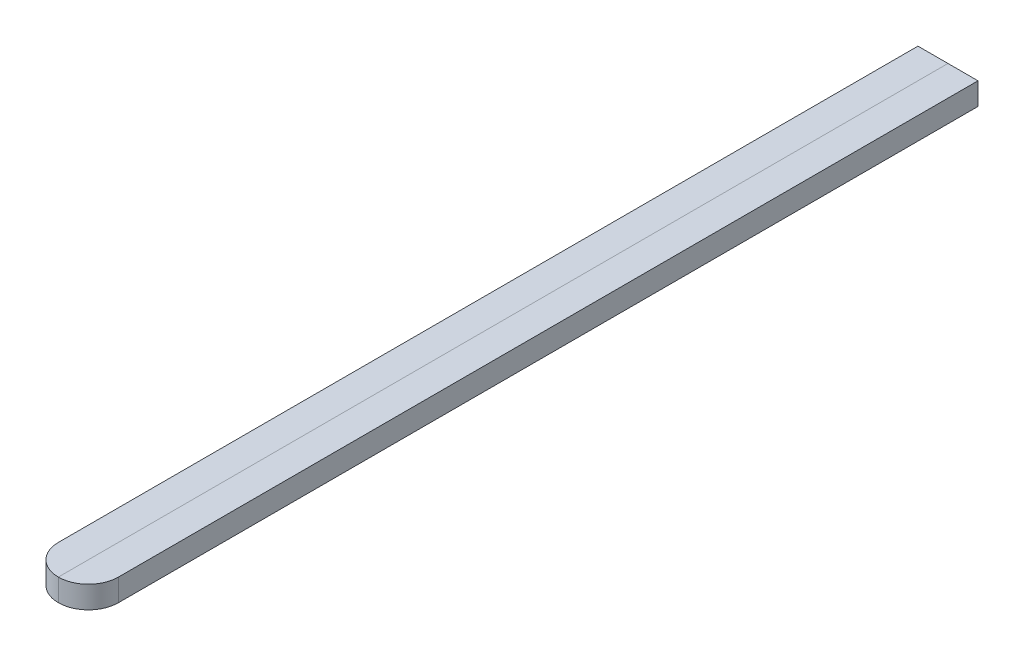
ISO-10303-21;
HEADER;
FILE_DESCRIPTION(('STEP AP214'),'2;1');
FILE_NAME('part.step','',(''),(''),'','','');
FILE_SCHEMA(('AUTOMOTIVE_DESIGN { 1 0 10303 214 1 1 1 1 }'));
ENDSEC;
DATA;
#1=APPLICATION_CONTEXT('core data for automotive mechanical design processes');
#2=APPLICATION_PROTOCOL_DEFINITION('international standard','automotive_design',2000,#1);
#3=PRODUCT_CONTEXT('',#1,'mechanical');
#4=PRODUCT('Part','Part','',(#3));
#5=PRODUCT_RELATED_PRODUCT_CATEGORY('part','',(#4));
#6=PRODUCT_DEFINITION_FORMATION('','',#4);
#7=PRODUCT_DEFINITION_CONTEXT('part definition',#1,'design');
#8=PRODUCT_DEFINITION('design','',#6,#7);
#9=PRODUCT_DEFINITION_SHAPE('','',#8);
#10=(LENGTH_UNIT() NAMED_UNIT(*) SI_UNIT(.MILLI.,.METRE.));
#11=(NAMED_UNIT(*) PLANE_ANGLE_UNIT() SI_UNIT($,.RADIAN.));
#12=(NAMED_UNIT(*) SI_UNIT($,.STERADIAN.) SOLID_ANGLE_UNIT());
#13=UNCERTAINTY_MEASURE_WITH_UNIT(LENGTH_MEASURE(1.E-05),#10,'distance_accuracy_value','');
#14=(GEOMETRIC_REPRESENTATION_CONTEXT(3) GLOBAL_UNCERTAINTY_ASSIGNED_CONTEXT((#13)) GLOBAL_UNIT_ASSIGNED_CONTEXT((#10,
#11,#12)) REPRESENTATION_CONTEXT('',''));
#15=CARTESIAN_POINT('',(0.,0.,0.));
#16=DIRECTION('',(0.,0.,1.));
#17=DIRECTION('',(1.,0.,0.));
#18=AXIS2_PLACEMENT_3D('',#15,#16,#17);
#19=CARTESIAN_POINT('',(3.429,0.,0.));
#20=DIRECTION('',(1.,0.,0.));
#21=DIRECTION('',(0.,0.,-1.));
#22=AXIS2_PLACEMENT_3D('',#19,#20,#21);
#23=PLANE('',#22);
#24=DIRECTION('',(0.,-1.,0.));
#25=VECTOR('',#24,1.);
#26=CARTESIAN_POINT('',(3.429,0.,0.));
#27=LINE('',#26,#25);
#28=CARTESIAN_POINT('',(3.429,2.54,0.));
#29=VERTEX_POINT('',#28);
#30=CARTESIAN_POINT('',(3.429,0.,0.));
#31=VERTEX_POINT('',#30);
#32=EDGE_CURVE('E110',#29,#31,#27,.T.);
#33=ORIENTED_EDGE('',*,*,#32,.F.);
#34=DIRECTION('',(0.,0.,1.));
#35=VECTOR('',#34,1.);
#36=CARTESIAN_POINT('',(3.429,2.54,101.6));
#37=LINE('',#36,#35);
#38=CARTESIAN_POINT('',(3.429,2.54,101.6));
#39=VERTEX_POINT('',#38);
#40=EDGE_CURVE('E125',#29,#39,#37,.T.);
#41=ORIENTED_EDGE('',*,*,#40,.T.);
#42=DIRECTION('',(0.,1.,0.));
#43=VECTOR('',#42,1.);
#44=CARTESIAN_POINT('',(3.429,-0.00100000000000013,101.6));
#45=LINE('',#44,#43);
#46=CARTESIAN_POINT('',(3.429,0.,101.6));
#47=VERTEX_POINT('',#46);
#48=EDGE_CURVE('E121',#47,#39,#45,.T.);
#49=ORIENTED_EDGE('',*,*,#48,.F.);
#50=DIRECTION('',(0.,0.,-1.));
#51=VECTOR('',#50,1.);
#52=CARTESIAN_POINT('',(3.429,0.,101.6));
#53=LINE('',#52,#51);
#54=EDGE_CURVE('E122',#47,#31,#53,.T.);
#55=ORIENTED_EDGE('',*,*,#54,.T.);
#56=EDGE_LOOP('',(#33,#41,#49,#55));
#57=FACE_BOUND('',#56,.T.);
#58=ADVANCED_FACE('F71',(#57),#23,.T.);
#59=CARTESIAN_POINT('',(0.,0.,101.6));
#60=DIRECTION('',(1.,0.,0.));
#61=DIRECTION('',(0.,0.,-1.));
#62=AXIS2_PLACEMENT_3D('',#59,#60,#61);
#63=PLANE('',#62);
#64=DIRECTION('',(0.,0.,-1.));
#65=VECTOR('',#64,1.);
#66=CARTESIAN_POINT('',(0.,0.,101.6));
#67=LINE('',#66,#65);
#68=CARTESIAN_POINT('',(0.,0.,98.171));
#69=VERTEX_POINT('',#68);
#70=CARTESIAN_POINT('',(0.,0.,0.));
#71=VERTEX_POINT('',#70);
#72=EDGE_CURVE('E129',#69,#71,#67,.T.);
#73=ORIENTED_EDGE('',*,*,#72,.F.);
#74=DIRECTION('',(0.,1.,0.));
#75=VECTOR('',#74,1.);
#76=CARTESIAN_POINT('',(0.,-0.00100000000000013,98.171));
#77=LINE('',#76,#75);
#78=CARTESIAN_POINT('',(0.,2.54,98.171));
#79=VERTEX_POINT('',#78);
#80=EDGE_CURVE('E132',#69,#79,#77,.T.);
#81=ORIENTED_EDGE('',*,*,#80,.T.);
#82=DIRECTION('',(0.,0.,-1.));
#83=VECTOR('',#82,1.);
#84=CARTESIAN_POINT('',(0.,2.54,101.6));
#85=LINE('',#84,#83);
#86=CARTESIAN_POINT('',(0.,2.54,0.));
#87=VERTEX_POINT('',#86);
#88=EDGE_CURVE('E134',#79,#87,#85,.T.);
#89=ORIENTED_EDGE('',*,*,#88,.T.);
#90=DIRECTION('',(0.,-1.,0.));
#91=VECTOR('',#90,1.);
#92=CARTESIAN_POINT('',(0.,0.,0.));
#93=LINE('',#92,#91);
#94=EDGE_CURVE('E130',#87,#71,#93,.T.);
#95=ORIENTED_EDGE('',*,*,#94,.T.);
#96=EDGE_LOOP('',(#73,#81,#89,#95));
#97=FACE_BOUND('',#96,.T.);
#98=ADVANCED_FACE('F146',(#97),#63,.F.);
#99=CARTESIAN_POINT('',(0.,2.54,101.6));
#100=DIRECTION('',(0.,-1.,0.));
#101=DIRECTION('',(0.,0.,-1.));
#102=AXIS2_PLACEMENT_3D('',#99,#100,#101);
#103=PLANE('',#102);
#104=ORIENTED_EDGE('',*,*,#40,.F.);
#105=DIRECTION('',(-1.,0.,0.));
#106=VECTOR('',#105,1.);
#107=CARTESIAN_POINT('',(0.,2.54,0.));
#108=LINE('',#107,#106);
#109=EDGE_CURVE('E117',#29,#87,#108,.T.);
#110=ORIENTED_EDGE('',*,*,#109,.T.);
#111=ORIENTED_EDGE('',*,*,#88,.F.);
#112=CARTESIAN_POINT('',(3.429,2.54,98.171));
#113=DIRECTION('',(0.,1.,0.));
#114=DIRECTION('',(0.,0.,1.));
#115=AXIS2_PLACEMENT_3D('',#112,#113,#114);
#116=CIRCLE('',#115,3.42900000000002);
#117=EDGE_CURVE('E79',#79,#39,#116,.T.);
#118=ORIENTED_EDGE('',*,*,#117,.T.);
#119=EDGE_LOOP('',(#104,#110,#111,#118));
#120=FACE_BOUND('',#119,.T.);
#121=ADVANCED_FACE('F145',(#120),#103,.F.);
#122=CARTESIAN_POINT('',(0.,0.,101.6));
#123=DIRECTION('',(0.,1.,0.));
#124=DIRECTION('',(0.,0.,1.));
#125=AXIS2_PLACEMENT_3D('',#122,#123,#124);
#126=PLANE('',#125);
#127=ORIENTED_EDGE('',*,*,#54,.F.);
#128=CARTESIAN_POINT('',(3.429,0.,98.171));
#129=DIRECTION('',(0.,1.,0.));
#130=DIRECTION('',(0.,0.,1.));
#131=AXIS2_PLACEMENT_3D('',#128,#129,#130);
#132=CIRCLE('',#131,3.42900000000002);
#133=EDGE_CURVE('E13',#47,#69,#132,.F.);
#134=ORIENTED_EDGE('',*,*,#133,.T.);
#135=ORIENTED_EDGE('',*,*,#72,.T.);
#136=DIRECTION('',(1.,0.,0.));
#137=VECTOR('',#136,1.);
#138=CARTESIAN_POINT('',(0.,0.,0.));
#139=LINE('',#138,#137);
#140=EDGE_CURVE('E115',#71,#31,#139,.T.);
#141=ORIENTED_EDGE('',*,*,#140,.T.);
#142=EDGE_LOOP('',(#127,#134,#135,#141));
#143=FACE_BOUND('',#142,.T.);
#144=ADVANCED_FACE('F127',(#143),#126,.F.);
#145=CARTESIAN_POINT('',(3.429,-0.00100000000000013,98.171));
#146=DIRECTION('',(0.,1.,0.));
#147=DIRECTION('',(0.,0.,1.));
#148=AXIS2_PLACEMENT_3D('',#145,#146,#147);
#149=CYLINDRICAL_SURFACE('',#148,3.42900000000002);
#150=ORIENTED_EDGE('',*,*,#133,.F.);
#151=ORIENTED_EDGE('',*,*,#48,.T.);
#152=ORIENTED_EDGE('',*,*,#117,.F.);
#153=ORIENTED_EDGE('',*,*,#80,.F.);
#154=EDGE_LOOP('',(#150,#151,#152,#153));
#155=FACE_BOUND('',#154,.T.);
#156=ADVANCED_FACE('F73',(#155),#149,.T.);
#157=CARTESIAN_POINT('',(0.,0.,0.));
#158=DIRECTION('',(0.,0.,-1.));
#159=DIRECTION('',(-1.,0.,0.));
#160=AXIS2_PLACEMENT_3D('',#157,#158,#159);
#161=PLANE('',#160);
#162=ORIENTED_EDGE('',*,*,#109,.F.);
#163=ORIENTED_EDGE('',*,*,#32,.T.);
#164=ORIENTED_EDGE('',*,*,#140,.F.);
#165=ORIENTED_EDGE('',*,*,#94,.F.);
#166=EDGE_LOOP('',(#162,#163,#164,#165));
#167=FACE_BOUND('',#166,.T.);
#168=ADVANCED_FACE('F112',(#167),#161,.T.);
#169=CLOSED_SHELL('',(#58,#98,#121,#144,#156,#168));
#170=MANIFOLD_SOLID_BREP('B2',#169);
#171=CARTESIAN_POINT('',(3.429,0.,0.));
#172=DIRECTION('',(1.,0.,0.));
#173=DIRECTION('',(0.,0.,-1.));
#174=AXIS2_PLACEMENT_3D('',#171,#172,#173);
#175=PLANE('',#174);
#176=DIRECTION('',(0.,-1.,0.));
#177=VECTOR('',#176,1.);
#178=CARTESIAN_POINT('',(3.429,0.,0.));
#179=LINE('',#178,#177);
#180=CARTESIAN_POINT('',(3.429,2.54,0.));
#181=VERTEX_POINT('',#180);
#182=CARTESIAN_POINT('',(3.429,0.,0.));
#183=VERTEX_POINT('',#182);
#184=EDGE_CURVE('E209',#181,#183,#179,.T.);
#185=ORIENTED_EDGE('',*,*,#184,.T.);
#186=DIRECTION('',(0.,0.,-1.));
#187=VECTOR('',#186,1.);
#188=CARTESIAN_POINT('',(3.429,0.,101.6));
#189=LINE('',#188,#187);
#190=CARTESIAN_POINT('',(3.429,0.,101.6));
#191=VERTEX_POINT('',#190);
#192=EDGE_CURVE('E270',#191,#183,#189,.T.);
#193=ORIENTED_EDGE('',*,*,#192,.F.);
#194=DIRECTION('',(0.,1.,0.));
#195=VECTOR('',#194,1.);
#196=CARTESIAN_POINT('',(3.429,-0.00100000000000013,101.6));
#197=LINE('',#196,#195);
#198=CARTESIAN_POINT('',(3.429,2.54,101.6));
#199=VERTEX_POINT('',#198);
#200=EDGE_CURVE('E69',#191,#199,#197,.T.);
#201=ORIENTED_EDGE('',*,*,#200,.T.);
#202=DIRECTION('',(0.,0.,1.));
#203=VECTOR('',#202,1.);
#204=CARTESIAN_POINT('',(3.429,2.54,101.6));
#205=LINE('',#204,#203);
#206=EDGE_CURVE('E227',#181,#199,#205,.T.);
#207=ORIENTED_EDGE('',*,*,#206,.F.);
#208=EDGE_LOOP('',(#185,#193,#201,#207));
#209=FACE_BOUND('',#208,.T.);
#210=ADVANCED_FACE('F206',(#209),#175,.F.);
#211=CARTESIAN_POINT('',(0.,0.,101.6));
#212=DIRECTION('',(0.,1.,0.));
#213=DIRECTION('',(0.,0.,1.));
#214=AXIS2_PLACEMENT_3D('',#211,#212,#213);
#215=PLANE('',#214);
#216=CARTESIAN_POINT('',(3.429,0.,98.171));
#217=DIRECTION('',(0.,1.,0.));
#218=DIRECTION('',(0.,0.,1.));
#219=AXIS2_PLACEMENT_3D('',#216,#217,#218);
#220=CIRCLE('',#219,3.42900000000002);
#221=CARTESIAN_POINT('',(6.858,0.,98.171));
#222=VERTEX_POINT('',#221);
#223=EDGE_CURVE('E245',#222,#191,#220,.F.);
#224=ORIENTED_EDGE('',*,*,#223,.T.);
#225=ORIENTED_EDGE('',*,*,#192,.T.);
#226=DIRECTION('',(1.,0.,0.));
#227=VECTOR('',#226,1.);
#228=CARTESIAN_POINT('',(0.,0.,0.));
#229=LINE('',#228,#227);
#230=CARTESIAN_POINT('',(6.858,0.,0.));
#231=VERTEX_POINT('',#230);
#232=EDGE_CURVE('E264',#183,#231,#229,.T.);
#233=ORIENTED_EDGE('',*,*,#232,.T.);
#234=DIRECTION('',(0.,0.,-1.));
#235=VECTOR('',#234,1.);
#236=CARTESIAN_POINT('',(6.858,0.,101.6));
#237=LINE('',#236,#235);
#238=EDGE_CURVE('E258',#222,#231,#237,.T.);
#239=ORIENTED_EDGE('',*,*,#238,.F.);
#240=EDGE_LOOP('',(#224,#225,#233,#239));
#241=FACE_BOUND('',#240,.T.);
#242=ADVANCED_FACE('F262',(#241),#215,.F.);
#243=CARTESIAN_POINT('',(0.,2.54,101.6));
#244=DIRECTION('',(0.,-1.,0.));
#245=DIRECTION('',(0.,0.,-1.));
#246=AXIS2_PLACEMENT_3D('',#243,#244,#245);
#247=PLANE('',#246);
#248=DIRECTION('',(-1.,0.,0.));
#249=VECTOR('',#248,1.);
#250=CARTESIAN_POINT('',(0.,2.54,0.));
#251=LINE('',#250,#249);
#252=CARTESIAN_POINT('',(6.858,2.54,0.));
#253=VERTEX_POINT('',#252);
#254=EDGE_CURVE('E273',#253,#181,#251,.T.);
#255=ORIENTED_EDGE('',*,*,#254,.T.);
#256=ORIENTED_EDGE('',*,*,#206,.T.);
#257=CARTESIAN_POINT('',(3.429,2.54,98.171));
#258=DIRECTION('',(0.,1.,0.));
#259=DIRECTION('',(0.,0.,1.));
#260=AXIS2_PLACEMENT_3D('',#257,#258,#259);
#261=CIRCLE('',#260,3.42900000000002);
#262=CARTESIAN_POINT('',(6.858,2.54,98.171));
#263=VERTEX_POINT('',#262);
#264=EDGE_CURVE('E252',#199,#263,#261,.T.);
#265=ORIENTED_EDGE('',*,*,#264,.T.);
#266=DIRECTION('',(0.,0.,-1.));
#267=VECTOR('',#266,1.);
#268=CARTESIAN_POINT('',(6.858,2.54,101.6));
#269=LINE('',#268,#267);
#270=EDGE_CURVE('E260',#263,#253,#269,.T.);
#271=ORIENTED_EDGE('',*,*,#270,.T.);
#272=EDGE_LOOP('',(#255,#256,#265,#271));
#273=FACE_BOUND('',#272,.T.);
#274=ADVANCED_FACE('F287',(#273),#247,.F.);
#275=CARTESIAN_POINT('',(6.858,0.,101.6));
#276=DIRECTION('',(-1.,0.,0.));
#277=DIRECTION('',(0.,0.,1.));
#278=AXIS2_PLACEMENT_3D('',#275,#276,#277);
#279=PLANE('',#278);
#280=DIRECTION('',(0.,1.,0.));
#281=VECTOR('',#280,1.);
#282=CARTESIAN_POINT('',(6.858,-0.00100000000000013,98.171));
#283=LINE('',#282,#281);
#284=EDGE_CURVE('E248',#222,#263,#283,.T.);
#285=ORIENTED_EDGE('',*,*,#284,.F.);
#286=ORIENTED_EDGE('',*,*,#238,.T.);
#287=DIRECTION('',(0.,1.,0.));
#288=VECTOR('',#287,1.);
#289=CARTESIAN_POINT('',(6.858,0.,0.));
#290=LINE('',#289,#288);
#291=EDGE_CURVE('E282',#231,#253,#290,.T.);
#292=ORIENTED_EDGE('',*,*,#291,.T.);
#293=ORIENTED_EDGE('',*,*,#270,.F.);
#294=EDGE_LOOP('',(#285,#286,#292,#293));
#295=FACE_BOUND('',#294,.T.);
#296=ADVANCED_FACE('F256',(#295),#279,.F.);
#297=CARTESIAN_POINT('',(0.,0.,0.));
#298=DIRECTION('',(0.,0.,-1.));
#299=DIRECTION('',(-1.,0.,0.));
#300=AXIS2_PLACEMENT_3D('',#297,#298,#299);
#301=PLANE('',#300);
#302=ORIENTED_EDGE('',*,*,#184,.F.);
#303=ORIENTED_EDGE('',*,*,#254,.F.);
#304=ORIENTED_EDGE('',*,*,#291,.F.);
#305=ORIENTED_EDGE('',*,*,#232,.F.);
#306=EDGE_LOOP('',(#302,#303,#304,#305));
#307=FACE_BOUND('',#306,.T.);
#308=ADVANCED_FACE('F281',(#307),#301,.T.);
#309=CARTESIAN_POINT('',(3.429,-0.00100000000000013,98.171));
#310=DIRECTION('',(0.,1.,0.));
#311=DIRECTION('',(0.,0.,1.));
#312=AXIS2_PLACEMENT_3D('',#309,#310,#311);
#313=CYLINDRICAL_SURFACE('',#312,3.42900000000002);
#314=ORIENTED_EDGE('',*,*,#200,.F.);
#315=ORIENTED_EDGE('',*,*,#223,.F.);
#316=ORIENTED_EDGE('',*,*,#284,.T.);
#317=ORIENTED_EDGE('',*,*,#264,.F.);
#318=EDGE_LOOP('',(#314,#315,#316,#317));
#319=FACE_BOUND('',#318,.T.);
#320=ADVANCED_FACE('F247',(#319),#313,.T.);
#321=CLOSED_SHELL('',(#210,#242,#274,#296,#308,#320));
#322=MANIFOLD_SOLID_BREP('B7',#321);
#323=ADVANCED_BREP_SHAPE_REPRESENTATION('',(#18,#170,#322),#14);
#324=SHAPE_DEFINITION_REPRESENTATION(#9,#323);
ENDSEC;
END-ISO-10303-21;
